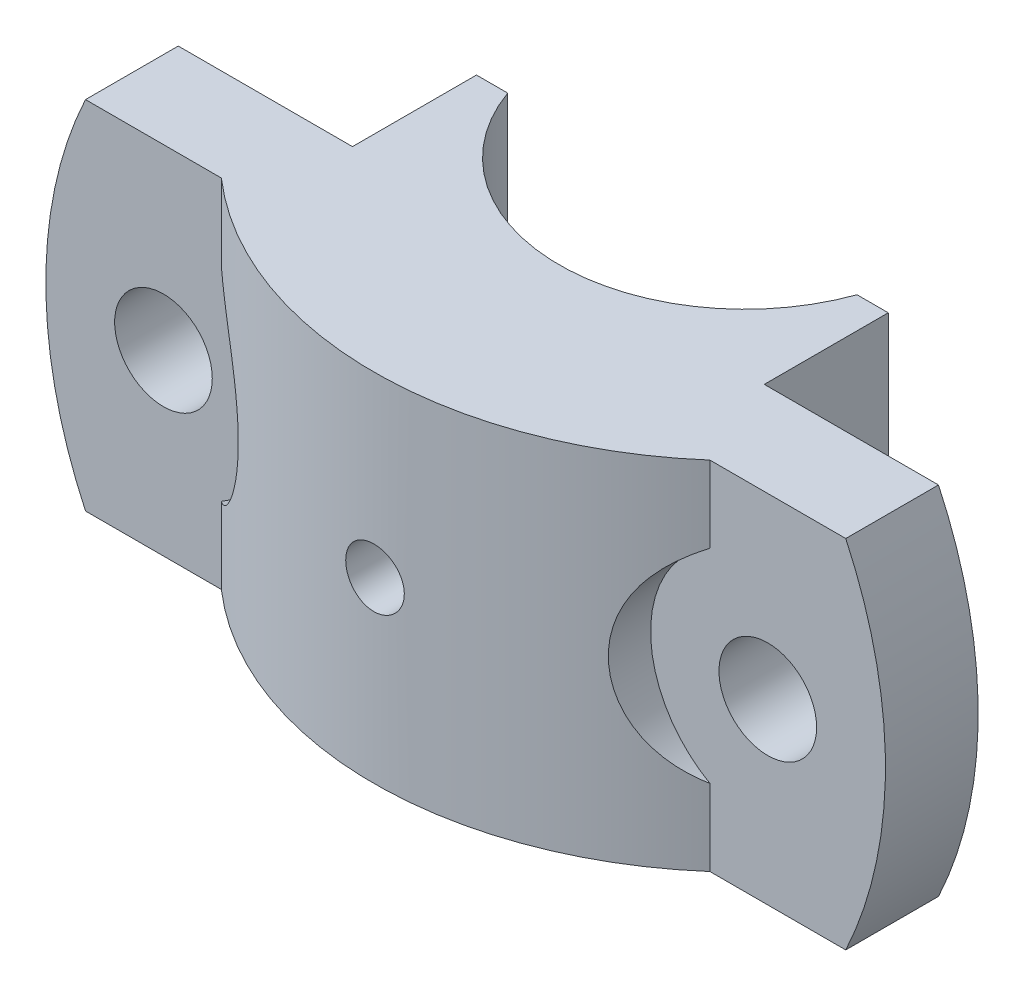
ISO-10303-21;
HEADER;
FILE_DESCRIPTION(('STEP AP214'),'2;1');
FILE_NAME('part.step','',(''),(''),'','','');
FILE_SCHEMA(('AUTOMOTIVE_DESIGN { 1 0 10303 214 1 1 1 1 }'));
ENDSEC;
DATA;
#1=APPLICATION_CONTEXT('core data for automotive mechanical design processes');
#2=APPLICATION_PROTOCOL_DEFINITION('international standard','automotive_design',2000,#1);
#3=PRODUCT_CONTEXT('',#1,'mechanical');
#4=PRODUCT('Part','Part','',(#3));
#5=PRODUCT_RELATED_PRODUCT_CATEGORY('part','',(#4));
#6=PRODUCT_DEFINITION_FORMATION('','',#4);
#7=PRODUCT_DEFINITION_CONTEXT('part definition',#1,'design');
#8=PRODUCT_DEFINITION('design','',#6,#7);
#9=PRODUCT_DEFINITION_SHAPE('','',#8);
#10=(LENGTH_UNIT() NAMED_UNIT(*) SI_UNIT(.MILLI.,.METRE.));
#11=(NAMED_UNIT(*) PLANE_ANGLE_UNIT() SI_UNIT($,.RADIAN.));
#12=(NAMED_UNIT(*) SI_UNIT($,.STERADIAN.) SOLID_ANGLE_UNIT());
#13=UNCERTAINTY_MEASURE_WITH_UNIT(LENGTH_MEASURE(1.E-05),#10,'distance_accuracy_value','');
#14=(GEOMETRIC_REPRESENTATION_CONTEXT(3) GLOBAL_UNCERTAINTY_ASSIGNED_CONTEXT((#13)) GLOBAL_UNIT_ASSIGNED_CONTEXT((#10,
#11,#12)) REPRESENTATION_CONTEXT('',''));
#15=CARTESIAN_POINT('',(0.,0.,0.));
#16=DIRECTION('',(0.,0.,1.));
#17=DIRECTION('',(1.,0.,0.));
#18=AXIS2_PLACEMENT_3D('',#15,#16,#17);
#19=CARTESIAN_POINT('',(0.,18.25,-19.1));
#20=DIRECTION('',(0.,-1.,0.));
#21=DIRECTION('',(0.,0.,-1.));
#22=AXIS2_PLACEMENT_3D('',#19,#20,#21);
#23=CYLINDRICAL_SURFACE('',#22,38.);
#24=CARTESIAN_POINT('',(0.,-3.,18.9));
#25=CARTESIAN_POINT('',(0.168230277437707,-2.99999263868346,18.8999984430739));
#26=CARTESIAN_POINT('',(0.336575845655096,-2.98580169916932,18.8988709200709));
#27=CARTESIAN_POINT('',(0.668611397196743,-2.92939894930333,18.8944814128081));
#28=CARTESIAN_POINT('',(0.83229585009201,-2.88715518982943,18.8912169949171));
#29=CARTESIAN_POINT('',(1.15015205512757,-2.77587406357067,18.8829226863334));
#30=CARTESIAN_POINT('',(1.3043290493551,-2.70685161752221,18.8778937789401));
#31=CARTESIAN_POINT('',(1.59887136159142,-2.54399853963546,18.8666348413683));
#32=CARTESIAN_POINT('',(1.73923967362019,-2.45017330191646,18.8604050724332));
#33=CARTESIAN_POINT('',(2.00254103126273,-2.24014409327318,18.8474277075509));
#34=CARTESIAN_POINT('',(2.12543792166293,-2.1238948563935,18.8406790810774));
#35=CARTESIAN_POINT('',(2.34999780988339,-1.87241281605956,18.8274332919605));
#36=CARTESIAN_POINT('',(2.45165988585508,-1.73717918887838,18.8209361402441));
#37=CARTESIAN_POINT('',(2.63098484586302,-1.45135065682847,18.8089176287414));
#38=CARTESIAN_POINT('',(2.708616254697,-1.30073594623714,18.803397552738));
#39=CARTESIAN_POINT('',(2.83747510230931,-0.988558849059874,18.7939696224707));
#40=CARTESIAN_POINT('',(2.8887029645124,-0.826996638082309,18.7900617423529));
#41=CARTESIAN_POINT('',(2.96319644645853,-0.497870679819641,18.7843090780475));
#42=CARTESIAN_POINT('',(2.98652059882487,-0.330320257357769,18.7824599758018));
#43=CARTESIAN_POINT('',(3.00472536931325,0.00632681714998114,18.7810204867557));
#44=CARTESIAN_POINT('',(2.99960647157769,0.175423442828303,18.7814300615093));
#45=CARTESIAN_POINT('',(2.96111886260011,0.509962310035283,18.7844577346025));
#46=CARTESIAN_POINT('',(2.92781369865023,0.675411913710737,18.7870708648728));
#47=CARTESIAN_POINT('',(2.83399765916122,0.998365215123264,18.7942034046858));
#48=CARTESIAN_POINT('',(2.77348654183749,1.15586884222906,18.7987228311701));
#49=CARTESIAN_POINT('',(2.62690490032728,1.45866214971911,18.8091644380148));
#50=CARTESIAN_POINT('',(2.54080579129679,1.60393793599879,18.8150881856643));
#51=CARTESIAN_POINT('',(2.34551283184452,1.87799978791044,18.8276694800349));
#52=CARTESIAN_POINT('',(2.23631856235736,2.0067855542603,18.8343270400699));
#53=CARTESIAN_POINT('',(1.99757813910437,2.24458115896057,18.847647885739));
#54=CARTESIAN_POINT('',(1.86797703439473,2.35353583758634,18.8543111370687));
#55=CARTESIAN_POINT('',(1.59229376436976,2.54815019879117,18.8668751419437));
#56=CARTESIAN_POINT('',(1.44621158946688,2.63380986781872,18.8727758950454));
#57=CARTESIAN_POINT('',(1.14167761997913,2.77939892547026,18.883150993084));
#58=CARTESIAN_POINT('',(0.983224692335487,2.83932595392176,18.8876252071703));
#59=CARTESIAN_POINT('',(0.658463212690176,2.93171041942903,18.8946415451888));
#60=CARTESIAN_POINT('',(0.492154807064346,2.96416836811962,18.897183705107));
#61=CARTESIAN_POINT('',(0.156881478742684,3.00062434440681,18.9000448768352));
#62=CARTESIAN_POINT('',(-0.0120751089608382,3.00469857910482,18.9003698415183));
#63=CARTESIAN_POINT('',(-0.348269003373999,2.98447098943403,18.8987758913175));
#64=CARTESIAN_POINT('',(-0.515506324442484,2.96016940224689,18.8968569951891));
#65=CARTESIAN_POINT('',(-0.843297753735755,2.88394314979588,18.8909950041868));
#66=CARTESIAN_POINT('',(-1.00386010671882,2.83205372367032,18.887054491835));
#67=CARTESIAN_POINT('',(-1.31399900365979,2.70216068710782,18.8775920824189));
#68=CARTESIAN_POINT('',(-1.46357539119334,2.62415670492505,18.872070162843));
#69=CARTESIAN_POINT('',(-1.74784375041781,2.44405671040129,18.8600494395666));
#70=CARTESIAN_POINT('',(-1.88250358772923,2.34191011569745,18.853548595394));
#71=CARTESIAN_POINT('',(-2.13279217984117,2.11649766051109,18.8403075453845));
#72=CARTESIAN_POINT('',(-2.24842063776818,1.99323147064188,18.8335673358158));
#73=CARTESIAN_POINT('',(-2.45762484975141,1.72874864835165,18.8205896766453));
#74=CARTESIAN_POINT('',(-2.55115094155127,1.58749266904679,18.8143533795852));
#75=CARTESIAN_POINT('',(-2.713155238272,1.29123629441747,18.8031055627809));
#76=CARTESIAN_POINT('',(-2.78163367119924,1.13623602422189,18.7980940318878));
#77=CARTESIAN_POINT('',(-2.89151387110069,0.817068099787168,18.7898693720601));
#78=CARTESIAN_POINT('',(-2.93294623887224,0.652911034998947,18.7866542112497));
#79=CARTESIAN_POINT('',(-2.98765790023766,0.319943850373173,18.7823793491511));
#80=CARTESIAN_POINT('',(-3.00093767292138,0.151133809767668,18.7813196111828));
#81=CARTESIAN_POINT('',(-2.99896188688675,-0.185853858942923,18.7814760426207));
#82=CARTESIAN_POINT('',(-2.98378436644711,-0.354031953001599,18.7826859878913));
#83=CARTESIAN_POINT('',(-2.92548733876923,-0.68544287301911,18.787232237977));
#84=CARTESIAN_POINT('',(-2.8823677867555,-0.848675691052988,18.7905685461995));
#85=CARTESIAN_POINT('',(-2.76943001015431,-1.16556899687011,18.7989899804525));
#86=CARTESIAN_POINT('',(-2.69961296444521,-1.31922990697071,18.8040750292632));
#87=CARTESIAN_POINT('',(-2.535271096382,-1.61266178094886,18.8154210711218));
#88=CARTESIAN_POINT('',(-2.44074672054794,-1.75243299578316,18.8216820429175));
#89=CARTESIAN_POINT('',(-2.22938062382269,-2.014516802884,18.8346948182221));
#90=CARTESIAN_POINT('',(-2.11248130954251,-2.13678288515433,18.841447859921));
#91=CARTESIAN_POINT('',(-1.85978424897896,-2.36000556130417,18.854672635902));
#92=CARTESIAN_POINT('',(-1.72398192526551,-2.46095697881558,18.8611443015481));
#93=CARTESIAN_POINT('',(-1.43709756450133,-2.63880542567551,18.8730876131211));
#94=CARTESIAN_POINT('',(-1.2859897583193,-2.71566096437293,18.878557527474));
#95=CARTESIAN_POINT('',(-0.973076064569829,-2.84281200189951,18.8878601967286));
#96=CARTESIAN_POINT('',(-0.811282773093929,-2.89313816633252,18.8916948408734));
#97=CARTESIAN_POINT('',(-0.540438770546243,-2.95292296572034,18.8963056825779));
#98=CARTESIAN_POINT('',(-0.433132098217287,-2.97055353917028,18.8976847801055));
#99=CARTESIAN_POINT('',(-0.217232975456248,-2.99409441950641,18.8995324404705));
#100=CARTESIAN_POINT('',(-0.108640528034261,-3.0000047538251,18.9000010054389));
#101=CARTESIAN_POINT('',(0.,-3.,18.9));
#102=B_SPLINE_CURVE_WITH_KNOTS('',3,(#24,#25,#26,#27,#28,#29,#30,#31,#32,#33,#34,#35,#36,#37,
#38,#39,#40,#41,#42,#43,#44,#45,#46,#47,#48,#49,#50,#51,#52,#53,#54,#55,#56,#57,#58,#59,#60,#61,
#62,#63,#64,#65,#66,#67,#68,#69,#70,#71,#72,#73,#74,#75,#76,#77,#78,#79,#80,#81,#82,#83,#84,#85,
#86,#87,#88,#89,#90,#91,#92,#93,#94,#95,#96,#97,#98,#99,#100,#101),.UNSPECIFIED.,.T.,.F.,(4,2,2,
2,2,2,2,2,2,2,2,2,2,2,2,2,2,2,2,2,2,2,2,2,2,2,2,2,2,2,2,2,2,2,2,2,2,2,4),(0.,0.504294188546741,
1.00916370078726,1.51375230936014,2.01823126998903,2.5237394549149,3.0292695804704,
3.53545907123702,4.04164044416132,4.54675814609821,5.05186725021795,5.55584058602808,
6.05981840083593,6.56436134901272,7.06891345298728,7.57484819748388,8.0807832362998,
8.58676466907349,9.09273667730812,9.59734968185781,10.1019584685879,10.6059242398502,
11.1098971854695,11.614935538604,12.1199817691652,12.6261522324058,13.1323180879118,
13.6379102536977,14.1434938154447,14.6476929456065,15.1518928837201,15.6560705605014,
16.1602391262259,16.6657233184336,17.1713301290485,17.6778028214878,18.183688785524,
18.5093549854356,18.8350204230892),.UNSPECIFIED.);
#103=CARTESIAN_POINT('',(0.,-3.,18.9));
#104=VERTEX_POINT('',#103);
#105=EDGE_CURVE('E11',#104,#104,#102,.T.);
#106=ORIENTED_EDGE('',*,*,#105,.F.);
#107=EDGE_LOOP('',(#106));
#108=FACE_BOUND('',#107,.T.);
#109=CARTESIAN_POINT('',(25.0207913543917,10.4328560249264,9.49999999999999));
#110=CARTESIAN_POINT('',(24.7730338146155,10.2920804074593,9.71680675147767));
#111=CARTESIAN_POINT('',(24.5259572074719,10.1399544561224,9.92722339791393));
#112=CARTESIAN_POINT('',(24.0357298789273,9.81222358107474,10.334409712425));
#113=CARTESIAN_POINT('',(23.7925828200892,9.63659802615019,10.5311671553518));
#114=CARTESIAN_POINT('',(23.3119135169276,9.2603084464708,10.910818308158));
#115=CARTESIAN_POINT('',(23.0744293781956,9.05951254132168,11.0936301751059));
#116=CARTESIAN_POINT('',(22.6097344144623,8.63361200296487,11.443155866201));
#117=CARTESIAN_POINT('',(22.3825207094897,8.40851424507995,11.6098742182703));
#118=CARTESIAN_POINT('',(21.9403544092314,7.93298765297099,11.9273329109952));
#119=CARTESIAN_POINT('',(21.7254811429389,7.68241860063286,12.0779742842576));
#120=CARTESIAN_POINT('',(21.3128998214101,7.15804390400721,12.3614523093702));
#121=CARTESIAN_POINT('',(21.1151936165785,6.88423576109691,12.4942870427137));
#122=CARTESIAN_POINT('',(20.7409115405157,6.31585062020436,12.7412429170662));
#123=CARTESIAN_POINT('',(20.5642773116706,6.02133474958124,12.8554160813007));
#124=CARTESIAN_POINT('',(20.2346733705904,5.41307462322203,13.0651393065546));
#125=CARTESIAN_POINT('',(20.0816999435517,5.09933339673489,13.160692291601));
#126=CARTESIAN_POINT('',(19.8184917932791,4.49285583069962,13.3229614594189));
#127=CARTESIAN_POINT('',(19.7053549093299,4.20192543663678,13.3917396083569));
#128=CARTESIAN_POINT('',(19.5013821832397,3.60933685686564,13.5145716567814));
#129=CARTESIAN_POINT('',(19.4105447512896,3.30767943768249,13.5686266059685));
#130=CARTESIAN_POINT('',(19.2524736130874,2.69587654952976,13.6620314296027));
#131=CARTESIAN_POINT('',(19.1852499901275,2.38572751535568,13.70137502264));
#132=CARTESIAN_POINT('',(19.0754556621514,1.75960271792686,13.7653471660128));
#133=CARTESIAN_POINT('',(19.032883988034,1.44362718422356,13.7899762947949));
#134=CARTESIAN_POINT('',(18.9751242567199,0.830846307492145,13.8233302459653));
#135=CARTESIAN_POINT('',(18.958221322786,0.534255117461409,13.8330515388875));
#136=CARTESIAN_POINT('',(18.9464748593678,-0.059497610289194,13.8398109109805));
#137=CARTESIAN_POINT('',(18.9516300531013,-0.356659114002614,13.8368497242465));
#138=CARTESIAN_POINT('',(18.9839285946314,-0.94930821991842,13.818244156838));
#139=CARTESIAN_POINT('',(19.0110664498911,-1.24479622168899,13.8026029443645));
#140=CARTESIAN_POINT('',(19.0869762956664,-1.83202532946942,13.7586252905354));
#141=CARTESIAN_POINT('',(19.1357483936098,-2.12376641686606,13.7302887861397));
#142=CARTESIAN_POINT('',(19.2534975083653,-2.6974842105692,13.6613707464776));
#143=CARTESIAN_POINT('',(19.3221915694879,-2.97953967918121,13.6209604696588));
#144=CARTESIAN_POINT('',(19.4791675619709,-3.53604088023158,13.527754357452));
#145=CARTESIAN_POINT('',(19.5674491572765,-3.81048674313369,13.4749587345529));
#146=CARTESIAN_POINT('',(19.7624585266407,-4.34984001890062,13.3570207954449));
#147=CARTESIAN_POINT('',(19.8691769217588,-4.61475219922952,13.2918847552801));
#148=CARTESIAN_POINT('',(20.0997822789535,-5.13355275394681,13.1492963943124));
#149=CARTESIAN_POINT('',(20.2236694811422,-5.38744097409593,13.0718439012572));
#150=CARTESIAN_POINT('',(20.4900910929291,-5.88834276751991,12.9028373343795));
#151=CARTESIAN_POINT('',(20.632983271784,-6.13507183331772,12.8110044340016));
#152=CARTESIAN_POINT('',(20.9333919912409,-6.614191088771,12.6147485870645));
#153=CARTESIAN_POINT('',(21.0909088626862,-6.84658095384352,12.5103253556677));
#154=CARTESIAN_POINT('',(21.4189542327693,-7.29635336107449,12.2889725741845));
#155=CARTESIAN_POINT('',(21.5895037022649,-7.51371059620133,12.172022740614));
#156=CARTESIAN_POINT('',(21.9414451466231,-7.93225845122159,11.9261031728455));
#157=CARTESIAN_POINT('',(22.1228383630416,-8.13344721369808,11.7971320613212));
#158=CARTESIAN_POINT('',(22.519422848937,-8.54503405171479,11.5095297539167));
#159=CARTESIAN_POINT('',(22.7358849903544,-8.75305070229539,11.3492402335868));
#160=CARTESIAN_POINT('',(23.1774907075674,-9.14744771180513,11.0144612062112));
#161=CARTESIAN_POINT('',(23.4026373328133,-9.33382037686547,10.8399666869258));
#162=CARTESIAN_POINT('',(23.8581744041456,-9.68443842635556,10.4782294882058));
#163=CARTESIAN_POINT('',(24.0885461008186,-9.84875165413444,10.2910286914109));
#164=CARTESIAN_POINT('',(24.5526714734652,-10.1563649024686,9.90445017302275));
#165=CARTESIAN_POINT('',(24.7864220785842,-10.2996828287867,9.70508303546958));
#166=CARTESIAN_POINT('',(25.0207913543916,-10.4328560249264,9.50000000000001));
#167=B_SPLINE_CURVE_WITH_KNOTS('',3,(#109,#110,#111,#112,#113,#114,#115,#116,#117,#118,#119,
#120,#121,#122,#123,#124,#125,#126,#127,#128,#129,#130,#131,#132,#133,#134,#135,#136,#137,#138,
#139,#140,#141,#142,#143,#144,#145,#146,#147,#148,#149,#150,#151,#152,#153,#154,#155,#156,#157,
#158,#159,#160,#161,#162,#163,#164,#165,#166),.UNSPECIFIED.,.F.,.F.,(4,2,2,2,2,2,2,2,2,2,2,2,2,
2,2,2,2,2,2,2,2,2,2,2,2,2,2,2,4),(0.,1.07412691090704,2.14920310389191,3.23016809511357,
4.31082806417474,5.39779726538831,6.48488348387054,7.56888552413468,8.65271720030374,
9.6103898904597,10.5679942848037,11.5260070885127,12.4839822288984,13.37460269517,
14.2651716106874,15.1555180793238,16.0458689691438,16.9241463250211,17.8024086138489,
18.6802254324982,19.5580545289706,20.4556969364183,21.3533596555016,22.2524985250644,
23.1517405395283,24.1715398475062,25.191700564882,26.2086481802059,27.2247233823766),.UNSPECIFIED.);
#168=CARTESIAN_POINT('',(25.0207913543916,10.4328560249264,9.5));
#169=VERTEX_POINT('',#168);
#170=CARTESIAN_POINT('',(25.0207913543916,-10.4328560249264,9.5));
#171=VERTEX_POINT('',#170);
#172=EDGE_CURVE('E140',#169,#171,#167,.T.);
#173=ORIENTED_EDGE('',*,*,#172,.F.);
#174=DIRECTION('',(0.,-1.,0.));
#175=VECTOR('',#174,1.);
#176=CARTESIAN_POINT('',(25.0207913543916,18.25,9.49999999999999));
#177=LINE('',#176,#175);
#178=CARTESIAN_POINT('',(25.0207913543916,18.25,9.49999999999999));
#179=VERTEX_POINT('',#178);
#180=EDGE_CURVE('E146',#179,#169,#177,.T.);
#181=ORIENTED_EDGE('',*,*,#180,.F.);
#182=CARTESIAN_POINT('',(0.,18.25,-19.1));
#183=DIRECTION('',(0.,-1.,0.));
#184=DIRECTION('',(0.,0.,-1.));
#185=AXIS2_PLACEMENT_3D('',#182,#183,#184);
#186=CIRCLE('',#185,38.);
#187=CARTESIAN_POINT('',(-25.0207913543916,18.25,9.49999999999999));
#188=VERTEX_POINT('',#187);
#189=EDGE_CURVE('E178',#179,#188,#186,.T.);
#190=ORIENTED_EDGE('',*,*,#189,.T.);
#191=DIRECTION('',(0.,-1.,0.));
#192=VECTOR('',#191,1.);
#193=CARTESIAN_POINT('',(-25.0207913543916,18.25,9.49999999999999));
#194=LINE('',#193,#192);
#195=CARTESIAN_POINT('',(-25.0207913543916,10.4328560249264,9.49999999999999));
#196=VERTEX_POINT('',#195);
#197=EDGE_CURVE('E183',#188,#196,#194,.T.);
#198=ORIENTED_EDGE('',*,*,#197,.T.);
#199=CARTESIAN_POINT('',(-25.0207913543916,10.4328560249264,9.49999999999999));
#200=CARTESIAN_POINT('',(-24.7730338146154,10.2920804074593,9.71680675147768));
#201=CARTESIAN_POINT('',(-24.5259572074719,10.1399544561224,9.92722339791393));
#202=CARTESIAN_POINT('',(-24.0357298789273,9.81222358107474,10.334409712425));
#203=CARTESIAN_POINT('',(-23.7925828200892,9.63659802615019,10.5311671553518));
#204=CARTESIAN_POINT('',(-23.3119135169276,9.26030844647079,10.910818308158));
#205=CARTESIAN_POINT('',(-23.0744293781956,9.05951254132168,11.0936301751059));
#206=CARTESIAN_POINT('',(-22.6097344144623,8.63361200296487,11.4431558662011));
#207=CARTESIAN_POINT('',(-22.3825207094897,8.40851424507995,11.6098742182703));
#208=CARTESIAN_POINT('',(-21.9403544092314,7.93298765297099,11.9273329109952));
#209=CARTESIAN_POINT('',(-21.7254811429389,7.68241860063286,12.0779742842577));
#210=CARTESIAN_POINT('',(-21.3128998214101,7.15804390400721,12.3614523093702));
#211=CARTESIAN_POINT('',(-21.1151936165785,6.88423576109691,12.4942870427137));
#212=CARTESIAN_POINT('',(-20.7409115405157,6.31585062020436,12.7412429170662));
#213=CARTESIAN_POINT('',(-20.5642773116706,6.02133474958124,12.8554160813007));
#214=CARTESIAN_POINT('',(-20.2346733705904,5.41307462322203,13.0651393065546));
#215=CARTESIAN_POINT('',(-20.0816999435517,5.09933339673488,13.160692291601));
#216=CARTESIAN_POINT('',(-19.8184917932791,4.49285583069962,13.3229614594189));
#217=CARTESIAN_POINT('',(-19.7053549093299,4.20192543663678,13.3917396083569));
#218=CARTESIAN_POINT('',(-19.5013821832397,3.60933685686564,13.5145716567813));
#219=CARTESIAN_POINT('',(-19.4105447512896,3.30767943768249,13.5686266059685));
#220=CARTESIAN_POINT('',(-19.2524736130874,2.69587654952976,13.6620314296027));
#221=CARTESIAN_POINT('',(-19.1852499901275,2.38572751535567,13.70137502264));
#222=CARTESIAN_POINT('',(-19.0754556621514,1.75960271792686,13.7653471660128));
#223=CARTESIAN_POINT('',(-19.032883988034,1.44362718422356,13.7899762947949));
#224=CARTESIAN_POINT('',(-18.9751242567199,0.830846307492143,13.8233302459653));
#225=CARTESIAN_POINT('',(-18.958221322786,0.534255117461407,13.8330515388875));
#226=CARTESIAN_POINT('',(-18.9464748593678,-0.0594976102891964,13.8398109109805));
#227=CARTESIAN_POINT('',(-18.9516300531013,-0.356659114002616,13.8368497242465));
#228=CARTESIAN_POINT('',(-18.9839285946314,-0.949308219918424,13.818244156838));
#229=CARTESIAN_POINT('',(-19.0110664498911,-1.244796221689,13.8026029443645));
#230=CARTESIAN_POINT('',(-19.0869762956664,-1.83202532946942,13.7586252905354));
#231=CARTESIAN_POINT('',(-19.1357483936098,-2.12376641686606,13.7302887861397));
#232=CARTESIAN_POINT('',(-19.2534975083653,-2.6974842105692,13.6613707464776));
#233=CARTESIAN_POINT('',(-19.3221915694879,-2.97953967918122,13.6209604696588));
#234=CARTESIAN_POINT('',(-19.4791675619709,-3.53604088023158,13.527754357452));
#235=CARTESIAN_POINT('',(-19.5674491572765,-3.81048674313369,13.4749587345529));
#236=CARTESIAN_POINT('',(-19.7624585266407,-4.34984001890062,13.3570207954449));
#237=CARTESIAN_POINT('',(-19.8691769217588,-4.61475219922952,13.2918847552801));
#238=CARTESIAN_POINT('',(-20.0997822789535,-5.13355275394681,13.1492963943124));
#239=CARTESIAN_POINT('',(-20.2236694811422,-5.38744097409593,13.0718439012572));
#240=CARTESIAN_POINT('',(-20.4900910929291,-5.88834276751991,12.9028373343795));
#241=CARTESIAN_POINT('',(-20.632983271784,-6.13507183331772,12.8110044340016));
#242=CARTESIAN_POINT('',(-20.9333919912409,-6.614191088771,12.6147485870645));
#243=CARTESIAN_POINT('',(-21.0909088626862,-6.84658095384352,12.5103253556677));
#244=CARTESIAN_POINT('',(-21.4189542327693,-7.29635336107449,12.2889725741845));
#245=CARTESIAN_POINT('',(-21.5895037022649,-7.51371059620132,12.172022740614));
#246=CARTESIAN_POINT('',(-21.9414451466231,-7.93225845122159,11.9261031728455));
#247=CARTESIAN_POINT('',(-22.1228383630416,-8.13344721369808,11.7971320613212));
#248=CARTESIAN_POINT('',(-22.519422848937,-8.54503405171479,11.5095297539167));
#249=CARTESIAN_POINT('',(-22.7358849903544,-8.75305070229539,11.3492402335868));
#250=CARTESIAN_POINT('',(-23.1774907075674,-9.14744771180513,11.0144612062112));
#251=CARTESIAN_POINT('',(-23.4026373328133,-9.33382037686547,10.8399666869258));
#252=CARTESIAN_POINT('',(-23.8581744041456,-9.68443842635556,10.4782294882058));
#253=CARTESIAN_POINT('',(-24.0885461008186,-9.84875165413444,10.2910286914109));
#254=CARTESIAN_POINT('',(-24.5526714734652,-10.1563649024686,9.90445017302275));
#255=CARTESIAN_POINT('',(-24.7864220785842,-10.2996828287868,9.70508303546958));
#256=CARTESIAN_POINT('',(-25.0207913543916,-10.4328560249264,9.50000000000001));
#257=B_SPLINE_CURVE_WITH_KNOTS('',3,(#199,#200,#201,#202,#203,#204,#205,#206,#207,#208,#209,
#210,#211,#212,#213,#214,#215,#216,#217,#218,#219,#220,#221,#222,#223,#224,#225,#226,#227,#228,
#229,#230,#231,#232,#233,#234,#235,#236,#237,#238,#239,#240,#241,#242,#243,#244,#245,#246,#247,
#248,#249,#250,#251,#252,#253,#254,#255,#256),.UNSPECIFIED.,.F.,.F.,(4,2,2,2,2,2,2,2,2,2,2,2,2,
2,2,2,2,2,2,2,2,2,2,2,2,2,2,2,4),(0.,1.07412691090704,2.14920310389191,3.23016809511357,
4.31082806417474,5.39779726538831,6.48488348387054,7.56888552413467,8.65271720030373,
9.61038989045969,10.5679942848037,11.5260070885127,12.4839822288984,13.3746026951699,
14.2651716106874,15.1555180793238,16.0458689691438,16.924146325021,17.8024086138488,
18.6802254324982,19.5580545289706,20.4556969364183,21.3533596555016,22.2524985250644,
23.1517405395283,24.1715398475062,25.191700564882,26.2086481802059,27.2247233823766),.UNSPECIFIED.);
#258=CARTESIAN_POINT('',(-25.0207913543916,-10.4328560249264,9.5));
#259=VERTEX_POINT('',#258);
#260=EDGE_CURVE('E46',#196,#259,#257,.T.);
#261=ORIENTED_EDGE('',*,*,#260,.T.);
#262=CARTESIAN_POINT('',(-25.0207913543916,-18.25,9.49999999999999));
#263=VERTEX_POINT('',#262);
#264=EDGE_CURVE('E180',#259,#263,#194,.T.);
#265=ORIENTED_EDGE('',*,*,#264,.T.);
#266=CARTESIAN_POINT('',(0.,-18.25,-19.1));
#267=DIRECTION('',(0.,-1.,0.));
#268=DIRECTION('',(0.,0.,-1.));
#269=AXIS2_PLACEMENT_3D('',#266,#267,#268);
#270=CIRCLE('',#269,38.);
#271=CARTESIAN_POINT('',(25.0207913543916,-18.25,9.49999999999999));
#272=VERTEX_POINT('',#271);
#273=EDGE_CURVE('E172',#272,#263,#270,.T.);
#274=ORIENTED_EDGE('',*,*,#273,.F.);
#275=EDGE_CURVE('E149',#171,#272,#177,.T.);
#276=ORIENTED_EDGE('',*,*,#275,.F.);
#277=EDGE_LOOP('',(#173,#181,#190,#198,#261,#265,#274,#276));
#278=FACE_BOUND('',#277,.T.);
#279=ADVANCED_FACE('F33',(#108,#278),#23,.T.);
#280=CARTESIAN_POINT('',(0.,0.,9.5));
#281=DIRECTION('',(0.,0.,1.));
#282=DIRECTION('',(1.,0.,0.));
#283=AXIS2_PLACEMENT_3D('',#280,#281,#282);
#284=PLANE('',#283);
#285=ORIENTED_EDGE('',*,*,#180,.T.);
#286=CARTESIAN_POINT('',(30.95,0.,9.5));
#287=DIRECTION('',(0.,0.,-1.));
#288=DIRECTION('',(-1.,0.,0.));
#289=AXIS2_PLACEMENT_3D('',#286,#287,#288);
#290=CIRCLE('',#289,12.);
#291=EDGE_CURVE('E53',#171,#169,#290,.T.);
#292=ORIENTED_EDGE('',*,*,#291,.F.);
#293=ORIENTED_EDGE('',*,*,#275,.T.);
#294=DIRECTION('',(1.,0.,0.));
#295=VECTOR('',#294,1.);
#296=CARTESIAN_POINT('',(-38.9350420572522,-18.25,9.5));
#297=LINE('',#296,#295);
#298=CARTESIAN_POINT('',(38.9350420572522,-18.25,9.5));
#299=VERTEX_POINT('',#298);
#300=EDGE_CURVE('E229',#272,#299,#297,.T.);
#301=ORIENTED_EDGE('',*,*,#300,.T.);
#302=CARTESIAN_POINT('',(0.,0.,9.5));
#303=DIRECTION('',(0.,0.,1.));
#304=DIRECTION('',(1.,0.,0.));
#305=AXIS2_PLACEMENT_3D('',#302,#303,#304);
#306=CIRCLE('',#305,43.);
#307=CARTESIAN_POINT('',(38.9350420572522,18.25,9.5));
#308=VERTEX_POINT('',#307);
#309=EDGE_CURVE('E222',#299,#308,#306,.T.);
#310=ORIENTED_EDGE('',*,*,#309,.T.);
#311=DIRECTION('',(-1.,0.,0.));
#312=VECTOR('',#311,1.);
#313=CARTESIAN_POINT('',(-38.9350420572522,18.25,9.5));
#314=LINE('',#313,#312);
#315=EDGE_CURVE('E154',#308,#179,#314,.T.);
#316=ORIENTED_EDGE('',*,*,#315,.T.);
#317=EDGE_LOOP('',(#285,#292,#293,#301,#310,#316));
#318=FACE_BOUND('',#317,.T.);
#319=CARTESIAN_POINT('',(30.95,0.,9.5));
#320=DIRECTION('',(0.,0.,1.));
#321=DIRECTION('',(1.,0.,0.));
#322=AXIS2_PLACEMENT_3D('',#319,#320,#321);
#323=CIRCLE('',#322,5.);
#324=CARTESIAN_POINT('',(35.95,0.,9.5));
#325=VERTEX_POINT('',#324);
#326=EDGE_CURVE('E205',#325,#325,#323,.T.);
#327=ORIENTED_EDGE('',*,*,#326,.F.);
#328=EDGE_LOOP('',(#327));
#329=FACE_BOUND('',#328,.T.);
#330=ADVANCED_FACE('F151',(#318,#329),#284,.T.);
#331=CARTESIAN_POINT('',(0.,0.,0.));
#332=DIRECTION('',(0.,0.,1.));
#333=DIRECTION('',(1.,0.,0.));
#334=AXIS2_PLACEMENT_3D('',#331,#332,#333);
#335=PLANE('',#334);
#336=CARTESIAN_POINT('',(30.95,0.,0.));
#337=DIRECTION('',(0.,0.,1.));
#338=DIRECTION('',(1.,0.,0.));
#339=AXIS2_PLACEMENT_3D('',#336,#337,#338);
#340=CIRCLE('',#339,5.);
#341=CARTESIAN_POINT('',(35.95,0.,0.));
#342=VERTEX_POINT('',#341);
#343=EDGE_CURVE('E217',#342,#342,#340,.T.);
#344=ORIENTED_EDGE('',*,*,#343,.T.);
#345=EDGE_LOOP('',(#344));
#346=FACE_BOUND('',#345,.T.);
#347=DIRECTION('',(0.,-1.,0.));
#348=VECTOR('',#347,1.);
#349=CARTESIAN_POINT('',(21.0896618190507,18.25,0.));
#350=LINE('',#349,#348);
#351=CARTESIAN_POINT('',(21.0896618190507,18.25,0.));
#352=VERTEX_POINT('',#351);
#353=CARTESIAN_POINT('',(21.0896618190507,-18.25,0.));
#354=VERTEX_POINT('',#353);
#355=EDGE_CURVE('E169',#352,#354,#350,.T.);
#356=ORIENTED_EDGE('',*,*,#355,.F.);
#357=DIRECTION('',(-1.,0.,0.));
#358=VECTOR('',#357,1.);
#359=CARTESIAN_POINT('',(-38.9350420572522,18.25,0.));
#360=LINE('',#359,#358);
#361=CARTESIAN_POINT('',(38.9350420572522,18.25,0.));
#362=VERTEX_POINT('',#361);
#363=EDGE_CURVE('E237',#362,#352,#360,.T.);
#364=ORIENTED_EDGE('',*,*,#363,.F.);
#365=CARTESIAN_POINT('',(0.,0.,0.));
#366=DIRECTION('',(0.,0.,1.));
#367=DIRECTION('',(1.,0.,0.));
#368=AXIS2_PLACEMENT_3D('',#365,#366,#367);
#369=CIRCLE('',#368,43.);
#370=CARTESIAN_POINT('',(38.9350420572522,-18.25,0.));
#371=VERTEX_POINT('',#370);
#372=EDGE_CURVE('E213',#371,#362,#369,.T.);
#373=ORIENTED_EDGE('',*,*,#372,.F.);
#374=DIRECTION('',(1.,0.,0.));
#375=VECTOR('',#374,1.);
#376=CARTESIAN_POINT('',(-38.9350420572522,-18.25,0.));
#377=LINE('',#376,#375);
#378=EDGE_CURVE('E242',#354,#371,#377,.T.);
#379=ORIENTED_EDGE('',*,*,#378,.F.);
#380=EDGE_LOOP('',(#356,#364,#373,#379));
#381=FACE_BOUND('',#380,.T.);
#382=ADVANCED_FACE('F290',(#346,#381),#335,.F.);
#383=CARTESIAN_POINT('',(0.,0.,9.5));
#384=DIRECTION('',(0.,0.,-1.));
#385=DIRECTION('',(-1.,0.,0.));
#386=AXIS2_PLACEMENT_3D('',#383,#384,#385);
#387=CYLINDRICAL_SURFACE('',#386,43.);
#388=ORIENTED_EDGE('',*,*,#372,.T.);
#389=DIRECTION('',(0.,0.,-1.));
#390=VECTOR('',#389,1.);
#391=CARTESIAN_POINT('',(38.9350420572522,18.25,9.5));
#392=LINE('',#391,#390);
#393=EDGE_CURVE('E253',#308,#362,#392,.T.);
#394=ORIENTED_EDGE('',*,*,#393,.F.);
#395=ORIENTED_EDGE('',*,*,#309,.F.);
#396=DIRECTION('',(0.,0.,-1.));
#397=VECTOR('',#396,1.);
#398=CARTESIAN_POINT('',(38.9350420572522,-18.25,9.5));
#399=LINE('',#398,#397);
#400=EDGE_CURVE('E233',#299,#371,#399,.T.);
#401=ORIENTED_EDGE('',*,*,#400,.T.);
#402=EDGE_LOOP('',(#388,#394,#395,#401));
#403=FACE_BOUND('',#402,.T.);
#404=ADVANCED_FACE('F35',(#403),#387,.T.);
#405=CARTESIAN_POINT('',(-38.9350420572522,18.25,9.5));
#406=DIRECTION('',(0.,-1.,0.));
#407=DIRECTION('',(0.,0.,-1.));
#408=AXIS2_PLACEMENT_3D('',#405,#406,#407);
#409=PLANE('',#408);
#410=ORIENTED_EDGE('',*,*,#363,.T.);
#411=DIRECTION('',(0.,0.,-1.));
#412=VECTOR('',#411,1.);
#413=CARTESIAN_POINT('',(21.0896618190507,18.25,-12.7));
#414=LINE('',#413,#412);
#415=CARTESIAN_POINT('',(21.0896618190507,18.25,-12.7));
#416=VERTEX_POINT('',#415);
#417=EDGE_CURVE('E165',#352,#416,#414,.T.);
#418=ORIENTED_EDGE('',*,*,#417,.T.);
#419=DIRECTION('',(-1.,0.,0.));
#420=VECTOR('',#419,1.);
#421=CARTESIAN_POINT('',(17.8896618190507,18.25,-12.7));
#422=LINE('',#421,#420);
#423=CARTESIAN_POINT('',(17.8896618190507,18.25,-12.7));
#424=VERTEX_POINT('',#423);
#425=EDGE_CURVE('E162',#416,#424,#422,.T.);
#426=ORIENTED_EDGE('',*,*,#425,.T.);
#427=CARTESIAN_POINT('',(0.,18.25,-19.1));
#428=DIRECTION('',(0.,1.,0.));
#429=DIRECTION('',(0.,0.,-1.));
#430=AXIS2_PLACEMENT_3D('',#427,#428,#429);
#431=CIRCLE('',#430,19.);
#432=CARTESIAN_POINT('',(-17.8896618190507,18.25,-12.7));
#433=VERTEX_POINT('',#432);
#434=EDGE_CURVE('E194',#433,#424,#431,.T.);
#435=ORIENTED_EDGE('',*,*,#434,.F.);
#436=DIRECTION('',(1.,0.,0.));
#437=VECTOR('',#436,1.);
#438=CARTESIAN_POINT('',(-17.8896618190507,18.25,-12.7));
#439=LINE('',#438,#437);
#440=CARTESIAN_POINT('',(-21.0896618190507,18.25,-12.7));
#441=VERTEX_POINT('',#440);
#442=EDGE_CURVE('E190',#441,#433,#439,.T.);
#443=ORIENTED_EDGE('',*,*,#442,.F.);
#444=DIRECTION('',(0.,0.,-1.));
#445=VECTOR('',#444,1.);
#446=CARTESIAN_POINT('',(-21.0896618190507,18.25,-12.7));
#447=LINE('',#446,#445);
#448=CARTESIAN_POINT('',(-21.0896618190507,18.25,0.));
#449=VERTEX_POINT('',#448);
#450=EDGE_CURVE('E187',#449,#441,#447,.T.);
#451=ORIENTED_EDGE('',*,*,#450,.F.);
#452=CARTESIAN_POINT('',(-38.9350420572522,18.25,0.));
#453=VERTEX_POINT('',#452);
#454=EDGE_CURVE('E236',#449,#453,#360,.T.);
#455=ORIENTED_EDGE('',*,*,#454,.T.);
#456=DIRECTION('',(0.,0.,-1.));
#457=VECTOR('',#456,1.);
#458=CARTESIAN_POINT('',(-38.9350420572522,18.25,9.5));
#459=LINE('',#458,#457);
#460=CARTESIAN_POINT('',(-38.9350420572522,18.25,9.5));
#461=VERTEX_POINT('',#460);
#462=EDGE_CURVE('E250',#461,#453,#459,.T.);
#463=ORIENTED_EDGE('',*,*,#462,.F.);
#464=EDGE_CURVE('E224',#188,#461,#314,.T.);
#465=ORIENTED_EDGE('',*,*,#464,.F.);
#466=ORIENTED_EDGE('',*,*,#189,.F.);
#467=ORIENTED_EDGE('',*,*,#315,.F.);
#468=ORIENTED_EDGE('',*,*,#393,.T.);
#469=EDGE_LOOP('',(#410,#418,#426,#435,#443,#451,#455,#463,#465,#466,#467,#468));
#470=FACE_BOUND('',#469,.T.);
#471=ADVANCED_FACE('F343',(#470),#409,.F.);
#472=CARTESIAN_POINT('',(0.,0.,9.5));
#473=DIRECTION('',(0.,0.,-1.));
#474=DIRECTION('',(-1.,0.,0.));
#475=AXIS2_PLACEMENT_3D('',#472,#473,#474);
#476=CYLINDRICAL_SURFACE('',#475,43.);
#477=CARTESIAN_POINT('',(0.,0.,0.));
#478=DIRECTION('',(0.,0.,1.));
#479=DIRECTION('',(1.,0.,0.));
#480=AXIS2_PLACEMENT_3D('',#477,#478,#479);
#481=CIRCLE('',#480,43.);
#482=CARTESIAN_POINT('',(-38.9350420572522,-18.25,0.));
#483=VERTEX_POINT('',#482);
#484=EDGE_CURVE('E240',#453,#483,#481,.T.);
#485=ORIENTED_EDGE('',*,*,#484,.T.);
#486=DIRECTION('',(0.,0.,-1.));
#487=VECTOR('',#486,1.);
#488=CARTESIAN_POINT('',(-38.9350420572522,-18.25,9.5));
#489=LINE('',#488,#487);
#490=CARTESIAN_POINT('',(-38.9350420572522,-18.25,9.5));
#491=VERTEX_POINT('',#490);
#492=EDGE_CURVE('E247',#491,#483,#489,.T.);
#493=ORIENTED_EDGE('',*,*,#492,.F.);
#494=CARTESIAN_POINT('',(0.,0.,9.5));
#495=DIRECTION('',(0.,0.,1.));
#496=DIRECTION('',(1.,0.,0.));
#497=AXIS2_PLACEMENT_3D('',#494,#495,#496);
#498=CIRCLE('',#497,43.);
#499=EDGE_CURVE('E227',#461,#491,#498,.T.);
#500=ORIENTED_EDGE('',*,*,#499,.F.);
#501=ORIENTED_EDGE('',*,*,#462,.T.);
#502=EDGE_LOOP('',(#485,#493,#500,#501));
#503=FACE_BOUND('',#502,.T.);
#504=ADVANCED_FACE('F354',(#503),#476,.T.);
#505=CARTESIAN_POINT('',(-38.9350420572522,-18.25,9.5));
#506=DIRECTION('',(0.,1.,0.));
#507=DIRECTION('',(0.,0.,1.));
#508=AXIS2_PLACEMENT_3D('',#505,#506,#507);
#509=PLANE('',#508);
#510=ORIENTED_EDGE('',*,*,#300,.F.);
#511=ORIENTED_EDGE('',*,*,#273,.T.);
#512=EDGE_CURVE('E230',#491,#263,#297,.T.);
#513=ORIENTED_EDGE('',*,*,#512,.F.);
#514=ORIENTED_EDGE('',*,*,#492,.T.);
#515=CARTESIAN_POINT('',(-21.0896618190507,-18.25,0.));
#516=VERTEX_POINT('',#515);
#517=EDGE_CURVE('E225',#483,#516,#377,.T.);
#518=ORIENTED_EDGE('',*,*,#517,.T.);
#519=DIRECTION('',(0.,0.,-1.));
#520=VECTOR('',#519,1.);
#521=CARTESIAN_POINT('',(-21.0896618190507,-18.25,-12.7));
#522=LINE('',#521,#520);
#523=CARTESIAN_POINT('',(-21.0896618190507,-18.25,-12.7));
#524=VERTEX_POINT('',#523);
#525=EDGE_CURVE('E186',#516,#524,#522,.T.);
#526=ORIENTED_EDGE('',*,*,#525,.T.);
#527=DIRECTION('',(1.,0.,0.));
#528=VECTOR('',#527,1.);
#529=CARTESIAN_POINT('',(-17.8896618190507,-18.25,-12.7));
#530=LINE('',#529,#528);
#531=CARTESIAN_POINT('',(-17.8896618190507,-18.25,-12.7));
#532=VERTEX_POINT('',#531);
#533=EDGE_CURVE('E199',#524,#532,#530,.T.);
#534=ORIENTED_EDGE('',*,*,#533,.T.);
#535=CARTESIAN_POINT('',(0.,-18.25,-19.1));
#536=DIRECTION('',(0.,1.,0.));
#537=DIRECTION('',(0.,0.,-1.));
#538=AXIS2_PLACEMENT_3D('',#535,#536,#537);
#539=CIRCLE('',#538,19.);
#540=CARTESIAN_POINT('',(17.8896618190507,-18.25,-12.7));
#541=VERTEX_POINT('',#540);
#542=EDGE_CURVE('E191',#532,#541,#539,.T.);
#543=ORIENTED_EDGE('',*,*,#542,.T.);
#544=DIRECTION('',(-1.,0.,0.));
#545=VECTOR('',#544,1.);
#546=CARTESIAN_POINT('',(17.8896618190507,-18.25,-12.7));
#547=LINE('',#546,#545);
#548=CARTESIAN_POINT('',(21.0896618190507,-18.25,-12.7));
#549=VERTEX_POINT('',#548);
#550=EDGE_CURVE('E155',#549,#541,#547,.T.);
#551=ORIENTED_EDGE('',*,*,#550,.F.);
#552=DIRECTION('',(0.,0.,-1.));
#553=VECTOR('',#552,1.);
#554=CARTESIAN_POINT('',(21.0896618190507,-18.25,-12.7));
#555=LINE('',#554,#553);
#556=EDGE_CURVE('E158',#354,#549,#555,.T.);
#557=ORIENTED_EDGE('',*,*,#556,.F.);
#558=ORIENTED_EDGE('',*,*,#378,.T.);
#559=ORIENTED_EDGE('',*,*,#400,.F.);
#560=EDGE_LOOP('',(#510,#511,#513,#514,#518,#526,#534,#543,#551,#557,#558,#559));
#561=FACE_BOUND('',#560,.T.);
#562=ADVANCED_FACE('F338',(#561),#509,.F.);
#563=ORIENTED_EDGE('',*,*,#264,.F.);
#564=CARTESIAN_POINT('',(-30.95,0.,9.5));
#565=DIRECTION('',(0.,0.,1.));
#566=DIRECTION('',(1.,0.,0.));
#567=AXIS2_PLACEMENT_3D('',#564,#565,#566);
#568=CIRCLE('',#567,12.);
#569=EDGE_CURVE('E61',#259,#196,#568,.T.);
#570=ORIENTED_EDGE('',*,*,#569,.T.);
#571=ORIENTED_EDGE('',*,*,#197,.F.);
#572=ORIENTED_EDGE('',*,*,#464,.T.);
#573=ORIENTED_EDGE('',*,*,#499,.T.);
#574=ORIENTED_EDGE('',*,*,#512,.T.);
#575=EDGE_LOOP('',(#563,#570,#571,#572,#573,#574));
#576=FACE_BOUND('',#575,.T.);
#577=CARTESIAN_POINT('',(-30.95,0.,9.5));
#578=DIRECTION('',(0.,0.,1.));
#579=DIRECTION('',(1.,0.,0.));
#580=AXIS2_PLACEMENT_3D('',#577,#578,#579);
#581=CIRCLE('',#580,5.);
#582=CARTESIAN_POINT('',(-25.95,0.,9.5));
#583=VERTEX_POINT('',#582);
#584=EDGE_CURVE('E214',#583,#583,#581,.T.);
#585=ORIENTED_EDGE('',*,*,#584,.F.);
#586=EDGE_LOOP('',(#585));
#587=FACE_BOUND('',#586,.T.);
#588=ADVANCED_FACE('F292',(#576,#587),#284,.T.);
#589=CARTESIAN_POINT('',(-30.95,0.,0.));
#590=DIRECTION('',(0.,0.,1.));
#591=DIRECTION('',(1.,0.,0.));
#592=AXIS2_PLACEMENT_3D('',#589,#590,#591);
#593=CIRCLE('',#592,5.);
#594=CARTESIAN_POINT('',(-25.95,0.,0.));
#595=VERTEX_POINT('',#594);
#596=EDGE_CURVE('E210',#595,#595,#593,.T.);
#597=ORIENTED_EDGE('',*,*,#596,.T.);
#598=EDGE_LOOP('',(#597));
#599=FACE_BOUND('',#598,.T.);
#600=ORIENTED_EDGE('',*,*,#454,.F.);
#601=DIRECTION('',(0.,-1.,0.));
#602=VECTOR('',#601,1.);
#603=CARTESIAN_POINT('',(-21.0896618190507,18.25,0.));
#604=LINE('',#603,#602);
#605=EDGE_CURVE('E196',#449,#516,#604,.T.);
#606=ORIENTED_EDGE('',*,*,#605,.T.);
#607=ORIENTED_EDGE('',*,*,#517,.F.);
#608=ORIENTED_EDGE('',*,*,#484,.F.);
#609=EDGE_LOOP('',(#600,#606,#607,#608));
#610=FACE_BOUND('',#609,.T.);
#611=ADVANCED_FACE('F348',(#599,#610),#335,.F.);
#612=CARTESIAN_POINT('',(30.95,0.,0.));
#613=DIRECTION('',(0.,0.,1.));
#614=DIRECTION('',(1.,0.,0.));
#615=AXIS2_PLACEMENT_3D('',#612,#613,#614);
#616=CYLINDRICAL_SURFACE('',#615,5.);
#617=ORIENTED_EDGE('',*,*,#343,.F.);
#618=EDGE_LOOP('',(#617));
#619=FACE_BOUND('',#618,.T.);
#620=ORIENTED_EDGE('',*,*,#326,.T.);
#621=EDGE_LOOP('',(#620));
#622=FACE_BOUND('',#621,.T.);
#623=ADVANCED_FACE('F376',(#619,#622),#616,.F.);
#624=CARTESIAN_POINT('',(-30.95,0.,0.));
#625=DIRECTION('',(0.,0.,1.));
#626=DIRECTION('',(1.,0.,0.));
#627=AXIS2_PLACEMENT_3D('',#624,#625,#626);
#628=CYLINDRICAL_SURFACE('',#627,5.);
#629=ORIENTED_EDGE('',*,*,#596,.F.);
#630=EDGE_LOOP('',(#629));
#631=FACE_BOUND('',#630,.T.);
#632=ORIENTED_EDGE('',*,*,#584,.T.);
#633=EDGE_LOOP('',(#632));
#634=FACE_BOUND('',#633,.T.);
#635=ADVANCED_FACE('F330',(#631,#634),#628,.F.);
#636=CARTESIAN_POINT('',(0.,18.25,-19.1));
#637=DIRECTION('',(0.,-1.,0.));
#638=DIRECTION('',(0.,0.,-1.));
#639=AXIS2_PLACEMENT_3D('',#636,#637,#638);
#640=CYLINDRICAL_SURFACE('',#639,19.);
#641=CARTESIAN_POINT('',(-2.,0.,-0.205556372308815));
#642=CARTESIAN_POINT('',(-1.99999516401008,0.112006479555373,-0.20555499467201));
#643=CARTESIAN_POINT('',(-1.9905592106298,0.224086240595606,-0.204549671059507));
#644=CARTESIAN_POINT('',(-1.95306115127686,0.445136057608282,-0.200637741308942));
#645=CARTESIAN_POINT('',(-1.92497872281664,0.554102585216902,-0.197729060783544));
#646=CARTESIAN_POINT('',(-1.85101648610887,0.765692926551291,-0.190343453406149));
#647=CARTESIAN_POINT('',(-1.80514771498838,0.868320628072947,-0.185867499275981));
#648=CARTESIAN_POINT('',(-1.69693653741929,1.06439918827942,-0.175852863614253));
#649=CARTESIAN_POINT('',(-1.63459731484353,1.15785181579727,-0.170314387533481));
#650=CARTESIAN_POINT('',(-1.49494626289544,1.33332404097734,-0.158773860108641));
#651=CARTESIAN_POINT('',(-1.41758174431317,1.41530160543184,-0.152770223468482));
#652=CARTESIAN_POINT('',(-1.25018900029688,1.56513447914722,-0.140990194330115));
#653=CARTESIAN_POINT('',(-1.16016018629753,1.63298913169084,-0.135213812409405));
#654=CARTESIAN_POINT('',(-0.969735405460028,1.75279657229377,-0.124523342528902));
#655=CARTESIAN_POINT('',(-0.869315789215432,1.80471196884071,-0.119611293526841));
#656=CARTESIAN_POINT('',(-0.661123884264189,1.89092794947994,-0.111220235079867));
#657=CARTESIAN_POINT('',(-0.553351792795345,1.92522900588491,-0.107741187210812));
#658=CARTESIAN_POINT('',(-0.333940151891589,1.97511882237852,-0.102619261746543));
#659=CARTESIAN_POINT('',(-0.222316507240329,1.99077682206352,-0.100969591490398));
#660=CARTESIAN_POINT('',(0.00198567037156372,2.00315035833957,-0.0996691727921622));
#661=CARTESIAN_POINT('',(0.114664173163607,1.99986643502093,-0.100018367356514));
#662=CARTESIAN_POINT('',(0.33740730415665,1.97450541115969,-0.102670786517158));
#663=CARTESIAN_POINT('',(0.447480514760361,1.95250276602704,-0.104966269453411));
#664=CARTESIAN_POINT('',(0.662363131902477,1.89044494113444,-0.11124446352276));
#665=CARTESIAN_POINT('',(0.767172463758142,1.85038950532589,-0.115227198586655));
#666=CARTESIAN_POINT('',(0.968786058908032,1.75328196358402,-0.124445509740932));
#667=CARTESIAN_POINT('',(1.0655744055176,1.69619705009711,-0.129683500234201));
#668=CARTESIAN_POINT('',(1.24822489495909,1.56667481333394,-0.140824902813426));
#669=CARTESIAN_POINT('',(1.33408668236401,1.49423699085135,-0.146728336533626));
#670=CARTESIAN_POINT('',(1.49288310796083,1.33564676900849,-0.158572270365654));
#671=CARTESIAN_POINT('',(1.56575304951111,1.24942957651342,-0.164512811414887));
#672=CARTESIAN_POINT('',(1.69599602157781,1.065952248856,-0.175732923552627));
#673=CARTESIAN_POINT('',(1.753369025438,0.968692094699111,-0.181012493504192));
#674=CARTESIAN_POINT('',(1.85098996715941,0.765838462243687,-0.190313246634634));
#675=CARTESIAN_POINT('',(1.89123368102303,0.660242936085271,-0.194334119360455));
#676=CARTESIAN_POINT('',(1.95340129286519,0.443741627947256,-0.200655869556557));
#677=CARTESIAN_POINT('',(1.97532581070551,0.332836025777559,-0.202956805223615));
#678=CARTESIAN_POINT('',(2.00014898085294,0.109431393357927,-0.205567963487218));
#679=CARTESIAN_POINT('',(2.00313824676669,-0.00305746217719825,-0.205887667001534));
#680=CARTESIAN_POINT('',(1.9902442443621,-0.226934449756774,-0.204525191782362));
#681=CARTESIAN_POINT('',(1.97436125914232,-0.338322598287419,-0.202843043078226));
#682=CARTESIAN_POINT('',(1.9242495201604,-0.55657072335367,-0.197675028858354));
#683=CARTESIAN_POINT('',(1.89006381000012,-0.663440691884067,-0.194193395958718));
#684=CARTESIAN_POINT('',(1.80436104075002,-0.86992978591994,-0.185822137656003));
#685=CARTESIAN_POINT('',(1.7528435432605,-0.969548727936447,-0.180932476637942));
#686=CARTESIAN_POINT('',(1.6337134067912,-1.15912038717151,-0.17027319681755));
#687=CARTESIAN_POINT('',(1.56604084168638,-1.24903526034219,-0.164500331162717));
#688=CARTESIAN_POINT('',(1.41660720976311,-1.41626220921351,-0.152735638092981));
#689=CARTESIAN_POINT('',(1.334845756178,-1.49357393882059,-0.146743804670558));
#690=CARTESIAN_POINT('',(1.15916162206616,-1.63371360684957,-0.135187584156689));
#691=CARTESIAN_POINT('',(1.06519158691192,-1.69648234962224,-0.129625003459531));
#692=CARTESIAN_POINT('',(0.867990954149677,-1.80534649584581,-0.119580469053567));
#693=CARTESIAN_POINT('',(0.764760495290902,-1.85144214905812,-0.115098499157643));
#694=CARTESIAN_POINT('',(0.55217406520502,-1.92555181625078,-0.107728311613639));
#695=CARTESIAN_POINT('',(0.442830566729635,-1.9536012854997,-0.104836970493836));
#696=CARTESIAN_POINT('',(0.220953848059184,-1.99093800961943,-0.100960968511319));
#697=CARTESIAN_POINT('',(0.108420727997878,-2.00022585282546,-0.0999762478600134));
#698=CARTESIAN_POINT('',(-0.116060069584248,-1.99976688852141,-0.100024516313382));
#699=CARTESIAN_POINT('',(-0.228007948108056,-1.99011185493867,-0.101047777208894));
#700=CARTESIAN_POINT('',(-0.448681769697405,-1.95223402357294,-0.104977818599652));
#701=CARTESIAN_POINT('',(-0.557407711015003,-1.92401121571688,-0.107884600116713));
#702=CARTESIAN_POINT('',(-0.768548390848817,-1.84982508387074,-0.115256124623417));
#703=CARTESIAN_POINT('',(-0.870964201951057,-1.80386478457258,-0.119720601973991));
#704=CARTESIAN_POINT('',(-1.06664262104474,-1.69551798950053,-0.129710498401429));
#705=CARTESIAN_POINT('',(-1.15990525084793,-1.63313153287098,-0.135235914950014));
#706=CARTESIAN_POINT('',(-1.33510009597663,-1.49335988609475,-0.146761123216803));
#707=CARTESIAN_POINT('',(-1.41697762938841,-1.41590632571249,-0.15276300057503));
#708=CARTESIAN_POINT('',(-1.56661295970767,-1.24833600496282,-0.164547189891321));
#709=CARTESIAN_POINT('',(-1.6343673732041,-1.15821621884343,-0.170329448965742));
#710=CARTESIAN_POINT('',(-1.75398534038454,-0.967593276938491,-0.181036943169119));
#711=CARTESIAN_POINT('',(-1.80580406414761,-0.867061873086138,-0.185959743994599));
#712=CARTESIAN_POINT('',(-1.891754927201,-0.658735476445404,-0.194362076908732));
#713=CARTESIAN_POINT('',(-1.92590687938194,-0.5509487743586,-0.197843224900928));
#714=CARTESIAN_POINT('',(-1.96710315002074,-0.368801138769014,-0.202096426431032));
#715=CARTESIAN_POINT('',(-1.97942244283178,-0.295601967588383,-0.20338770854682));
#716=CARTESIAN_POINT('',(-1.99587244910145,-0.148279235179064,-0.205118135490095));
#717=CARTESIAN_POINT('',(-2.00000320174435,-0.0741556783755079,-0.20555728439526));
#718=CARTESIAN_POINT('',(-2.,0.,-0.205556372308815));
#719=B_SPLINE_CURVE_WITH_KNOTS('',3,(#641,#642,#643,#644,#645,#646,#647,#648,#649,#650,#651,
#652,#653,#654,#655,#656,#657,#658,#659,#660,#661,#662,#663,#664,#665,#666,#667,#668,#669,#670,
#671,#672,#673,#674,#675,#676,#677,#678,#679,#680,#681,#682,#683,#684,#685,#686,#687,#688,#689,
#690,#691,#692,#693,#694,#695,#696,#697,#698,#699,#700,#701,#702,#703,#704,#705,#706,#707,#708,
#709,#710,#711,#712,#713,#714,#715,#716,#717,#718),.UNSPECIFIED.,.T.,.F.,(4,2,2,2,2,2,2,2,2,2,2,
2,2,2,2,2,2,2,2,2,2,2,2,2,2,2,2,2,2,2,2,2,2,2,2,2,2,2,4),(0.,0.335748617031671,
0.671863762935836,1.00777066905589,1.34361268907506,1.68065439356929,2.01771176704735,
2.35555389795905,2.69338696946484,3.02996138871607,3.36652621128151,3.70175854241439,
4.03699562840616,4.37288277110583,4.70878083699376,5.04630752720727,5.38383479799534,
5.72144525317367,6.05904428425398,6.39502652549657,6.73100372680587,7.06619423924191,
7.40139323080765,7.73785548838072,8.07432698395152,8.41214488899804,8.74995773335273,
9.08710483480116,9.42424136368026,9.75974857569332,10.0952559697202,10.4307061764935,
10.7661555838795,11.1031642511509,11.4402535614886,11.7782826675518,12.1159318551379,
12.3382206521887,12.5605083855275),.UNSPECIFIED.);
#720=CARTESIAN_POINT('',(-2.,0.,-0.205556372308815));
#721=VERTEX_POINT('',#720);
#722=EDGE_CURVE('E142',#721,#721,#719,.T.);
#723=ORIENTED_EDGE('',*,*,#722,.F.);
#724=EDGE_LOOP('',(#723));
#725=FACE_BOUND('',#724,.T.);
#726=ORIENTED_EDGE('',*,*,#542,.F.);
#727=DIRECTION('',(0.,-1.,0.));
#728=VECTOR('',#727,1.);
#729=CARTESIAN_POINT('',(-17.8896618190507,18.25,-12.7));
#730=LINE('',#729,#728);
#731=EDGE_CURVE('E203',#433,#532,#730,.T.);
#732=ORIENTED_EDGE('',*,*,#731,.F.);
#733=ORIENTED_EDGE('',*,*,#434,.T.);
#734=DIRECTION('',(0.,-1.,0.));
#735=VECTOR('',#734,1.);
#736=CARTESIAN_POINT('',(17.8896618190507,18.25,-12.7));
#737=LINE('',#736,#735);
#738=EDGE_CURVE('E166',#424,#541,#737,.T.);
#739=ORIENTED_EDGE('',*,*,#738,.T.);
#740=EDGE_LOOP('',(#726,#732,#733,#739));
#741=FACE_BOUND('',#740,.T.);
#742=ADVANCED_FACE('F326',(#725,#741),#640,.F.);
#743=CARTESIAN_POINT('',(-17.8896618190507,18.25,-12.7));
#744=DIRECTION('',(0.,0.,-1.));
#745=DIRECTION('',(-1.,0.,0.));
#746=AXIS2_PLACEMENT_3D('',#743,#744,#745);
#747=PLANE('',#746);
#748=ORIENTED_EDGE('',*,*,#533,.F.);
#749=DIRECTION('',(0.,-1.,0.));
#750=VECTOR('',#749,1.);
#751=CARTESIAN_POINT('',(-21.0896618190507,18.25,-12.7));
#752=LINE('',#751,#750);
#753=EDGE_CURVE('E206',#441,#524,#752,.T.);
#754=ORIENTED_EDGE('',*,*,#753,.F.);
#755=ORIENTED_EDGE('',*,*,#442,.T.);
#756=ORIENTED_EDGE('',*,*,#731,.T.);
#757=EDGE_LOOP('',(#748,#754,#755,#756));
#758=FACE_BOUND('',#757,.T.);
#759=ADVANCED_FACE('F329',(#758),#747,.T.);
#760=CARTESIAN_POINT('',(-21.0896618190507,18.25,-12.7));
#761=DIRECTION('',(-1.,0.,0.));
#762=DIRECTION('',(0.,0.,1.));
#763=AXIS2_PLACEMENT_3D('',#760,#761,#762);
#764=PLANE('',#763);
#765=ORIENTED_EDGE('',*,*,#525,.F.);
#766=ORIENTED_EDGE('',*,*,#605,.F.);
#767=ORIENTED_EDGE('',*,*,#450,.T.);
#768=ORIENTED_EDGE('',*,*,#753,.T.);
#769=EDGE_LOOP('',(#765,#766,#767,#768));
#770=FACE_BOUND('',#769,.T.);
#771=ADVANCED_FACE('F279',(#770),#764,.T.);
#772=CARTESIAN_POINT('',(21.0896618190507,18.25,-12.7));
#773=DIRECTION('',(-1.,0.,0.));
#774=DIRECTION('',(0.,0.,1.));
#775=AXIS2_PLACEMENT_3D('',#772,#773,#774);
#776=PLANE('',#775);
#777=ORIENTED_EDGE('',*,*,#556,.T.);
#778=DIRECTION('',(0.,-1.,0.));
#779=VECTOR('',#778,1.);
#780=CARTESIAN_POINT('',(21.0896618190507,18.25,-12.7));
#781=LINE('',#780,#779);
#782=EDGE_CURVE('E173',#416,#549,#781,.T.);
#783=ORIENTED_EDGE('',*,*,#782,.F.);
#784=ORIENTED_EDGE('',*,*,#417,.F.);
#785=ORIENTED_EDGE('',*,*,#355,.T.);
#786=EDGE_LOOP('',(#777,#783,#784,#785));
#787=FACE_BOUND('',#786,.T.);
#788=ADVANCED_FACE('F277',(#787),#776,.F.);
#789=CARTESIAN_POINT('',(17.8896618190507,18.25,-12.7));
#790=DIRECTION('',(0.,0.,1.));
#791=DIRECTION('',(1.,0.,0.));
#792=AXIS2_PLACEMENT_3D('',#789,#790,#791);
#793=PLANE('',#792);
#794=ORIENTED_EDGE('',*,*,#550,.T.);
#795=ORIENTED_EDGE('',*,*,#738,.F.);
#796=ORIENTED_EDGE('',*,*,#425,.F.);
#797=ORIENTED_EDGE('',*,*,#782,.T.);
#798=EDGE_LOOP('',(#794,#795,#796,#797));
#799=FACE_BOUND('',#798,.T.);
#800=ADVANCED_FACE('F274',(#799),#793,.F.);
#801=CARTESIAN_POINT('',(-30.95,0.,18.9));
#802=DIRECTION('',(0.,0.,-1.));
#803=DIRECTION('',(-1.,0.,0.));
#804=AXIS2_PLACEMENT_3D('',#801,#802,#803);
#805=CYLINDRICAL_SURFACE('',#804,12.);
#806=ORIENTED_EDGE('',*,*,#569,.F.);
#807=ORIENTED_EDGE('',*,*,#260,.F.);
#808=EDGE_LOOP('',(#806,#807));
#809=FACE_BOUND('',#808,.T.);
#810=ADVANCED_FACE('F269',(#809),#805,.F.);
#811=CARTESIAN_POINT('',(30.95,0.,18.9));
#812=DIRECTION('',(0.,0.,-1.));
#813=DIRECTION('',(-1.,0.,0.));
#814=AXIS2_PLACEMENT_3D('',#811,#812,#813);
#815=CYLINDRICAL_SURFACE('',#814,12.);
#816=ORIENTED_EDGE('',*,*,#172,.T.);
#817=ORIENTED_EDGE('',*,*,#291,.T.);
#818=EDGE_LOOP('',(#816,#817));
#819=FACE_BOUND('',#818,.T.);
#820=ADVANCED_FACE('F139',(#819),#815,.F.);
#821=CARTESIAN_POINT('',(0.,0.,-13.7283272283272));
#822=DIRECTION('',(0.,0.,-1.));
#823=DIRECTION('',(-1.,0.,0.));
#824=AXIS2_PLACEMENT_3D('',#821,#822,#823);
#825=CYLINDRICAL_SURFACE('',#824,3.);
#826=ORIENTED_EDGE('',*,*,#105,.T.);
#827=EDGE_LOOP('',(#826));
#828=FACE_BOUND('',#827,.T.);
#829=CARTESIAN_POINT('',(0.,0.,0.));
#830=DIRECTION('',(0.,0.,-1.));
#831=DIRECTION('',(-1.,0.,0.));
#832=AXIS2_PLACEMENT_3D('',#829,#830,#831);
#833=CIRCLE('',#832,3.);
#834=CARTESIAN_POINT('',(-3.,0.,0.));
#835=VERTEX_POINT('',#834);
#836=EDGE_CURVE('E301',#835,#835,#833,.T.);
#837=ORIENTED_EDGE('',*,*,#836,.T.);
#838=EDGE_LOOP('',(#837));
#839=FACE_BOUND('',#838,.T.);
#840=ADVANCED_FACE('F295',(#828,#839),#825,.F.);
#841=CARTESIAN_POINT('',(0.,3.,0.));
#842=DIRECTION('',(0.,0.,-1.));
#843=DIRECTION('',(-1.,0.,0.));
#844=AXIS2_PLACEMENT_3D('',#841,#842,#843);
#845=PLANE('',#844);
#846=ORIENTED_EDGE('',*,*,#836,.F.);
#847=EDGE_LOOP('',(#846));
#848=FACE_BOUND('',#847,.T.);
#849=CARTESIAN_POINT('',(0.,0.,0.));
#850=DIRECTION('',(0.,0.,-1.));
#851=DIRECTION('',(-1.,0.,0.));
#852=AXIS2_PLACEMENT_3D('',#849,#850,#851);
#853=CIRCLE('',#852,2.);
#854=CARTESIAN_POINT('',(-2.,0.,0.));
#855=VERTEX_POINT('',#854);
#856=EDGE_CURVE('E303',#855,#855,#853,.T.);
#857=ORIENTED_EDGE('',*,*,#856,.T.);
#858=EDGE_LOOP('',(#857));
#859=FACE_BOUND('',#858,.T.);
#860=ADVANCED_FACE('F298',(#848,#859),#845,.F.);
#861=CARTESIAN_POINT('',(0.,0.,-13.7283272283272));
#862=DIRECTION('',(0.,0.,-1.));
#863=DIRECTION('',(-1.,0.,0.));
#864=AXIS2_PLACEMENT_3D('',#861,#862,#863);
#865=CYLINDRICAL_SURFACE('',#864,2.);
#866=ORIENTED_EDGE('',*,*,#722,.T.);
#867=EDGE_LOOP('',(#866));
#868=FACE_BOUND('',#867,.T.);
#869=ORIENTED_EDGE('',*,*,#856,.F.);
#870=EDGE_LOOP('',(#869));
#871=FACE_BOUND('',#870,.T.);
#872=ADVANCED_FACE('F315',(#868,#871),#865,.F.);
#873=CLOSED_SHELL('',(#279,#330,#382,#404,#471,#504,#562,#588,#611,#623,#635,#742,#759,#771,
#788,#800,#810,#820,#840,#860,#872));
#874=MANIFOLD_SOLID_BREP('B2',#873);
#875=ADVANCED_BREP_SHAPE_REPRESENTATION('',(#18,#874),#14);
#876=SHAPE_DEFINITION_REPRESENTATION(#9,#875);
ENDSEC;
END-ISO-10303-21;
